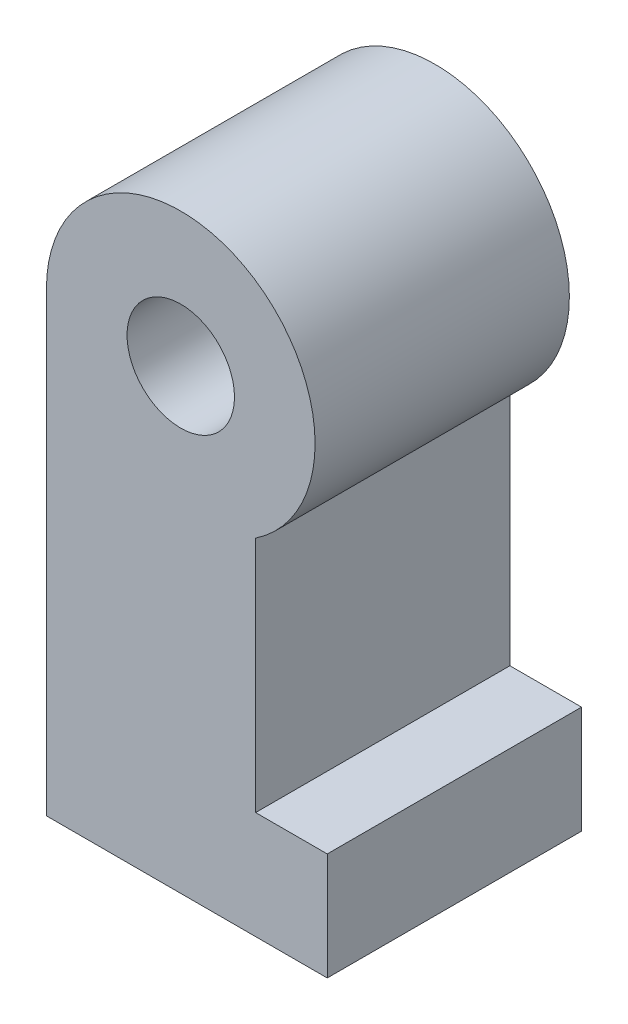
ISO-10303-21;
HEADER;
FILE_DESCRIPTION(('STEP AP214'),'2;1');
FILE_NAME('part.step','',(''),(''),'','','');
FILE_SCHEMA(('AUTOMOTIVE_DESIGN { 1 0 10303 214 1 1 1 1 }'));
ENDSEC;
DATA;
#1=APPLICATION_CONTEXT('core data for automotive mechanical design processes');
#2=APPLICATION_PROTOCOL_DEFINITION('international standard','automotive_design',2000,#1);
#3=PRODUCT_CONTEXT('',#1,'mechanical');
#4=PRODUCT('Part','Part','',(#3));
#5=PRODUCT_RELATED_PRODUCT_CATEGORY('part','',(#4));
#6=PRODUCT_DEFINITION_FORMATION('','',#4);
#7=PRODUCT_DEFINITION_CONTEXT('part definition',#1,'design');
#8=PRODUCT_DEFINITION('design','',#6,#7);
#9=PRODUCT_DEFINITION_SHAPE('','',#8);
#10=(LENGTH_UNIT() NAMED_UNIT(*) SI_UNIT(.MILLI.,.METRE.));
#11=(NAMED_UNIT(*) PLANE_ANGLE_UNIT() SI_UNIT($,.RADIAN.));
#12=(NAMED_UNIT(*) SI_UNIT($,.STERADIAN.) SOLID_ANGLE_UNIT());
#13=UNCERTAINTY_MEASURE_WITH_UNIT(LENGTH_MEASURE(1.E-05),#10,'distance_accuracy_value','');
#14=(GEOMETRIC_REPRESENTATION_CONTEXT(3) GLOBAL_UNCERTAINTY_ASSIGNED_CONTEXT((#13)) GLOBAL_UNIT_ASSIGNED_CONTEXT((#10,
#11,#12)) REPRESENTATION_CONTEXT('',''));
#15=CARTESIAN_POINT('',(0.,0.,0.));
#16=DIRECTION('',(0.,0.,1.));
#17=DIRECTION('',(1.,0.,0.));
#18=AXIS2_PLACEMENT_3D('',#15,#16,#17);
#19=CARTESIAN_POINT('',(0.,0.,180.34));
#20=DIRECTION('',(0.,0.,-1.));
#21=DIRECTION('',(-1.,0.,0.));
#22=AXIS2_PLACEMENT_3D('',#19,#20,#21);
#23=CYLINDRICAL_SURFACE('',#22,95.25);
#24=DIRECTION('',(0.,0.,-1.));
#25=VECTOR('',#24,1.);
#26=CARTESIAN_POINT('',(-95.25,0.,180.34));
#27=LINE('',#26,#25);
#28=CARTESIAN_POINT('',(-95.25,0.,29.2481119136965));
#29=VERTEX_POINT('',#28);
#30=CARTESIAN_POINT('',(-95.25,0.,0.));
#31=VERTEX_POINT('',#30);
#32=EDGE_CURVE('E145',#29,#31,#27,.T.);
#33=ORIENTED_EDGE('',*,*,#32,.F.);
#34=CARTESIAN_POINT('',(-95.25,0.,29.2481119136965));
#35=CARTESIAN_POINT('',(-95.2500220134724,0.794121248174932,29.3772159922998));
#36=CARTESIAN_POINT('',(-95.2400696552208,1.58569458789559,29.5218851932676));
#37=CARTESIAN_POINT('',(-95.2007576113502,3.16207438019551,29.841923412198));
#38=CARTESIAN_POINT('',(-95.1713991743181,3.94688126483763,30.0172904545284));
#39=CARTESIAN_POINT('',(-95.0938432863656,5.50761564638114,30.3981778823305));
#40=CARTESIAN_POINT('',(-95.0456589785493,6.28354895014492,30.6036771688688));
#41=CARTESIAN_POINT('',(-94.9311356611116,7.82557924546193,31.044376187994));
#42=CARTESIAN_POINT('',(-94.8647964323256,8.59167611815374,31.2795762791079));
#43=CARTESIAN_POINT('',(-94.7151917231344,10.1080060481254,31.7775541407689));
#44=CARTESIAN_POINT('',(-94.6320310882169,10.8583070454424,32.0401564343052));
#45=CARTESIAN_POINT('',(-94.4493982110557,12.3465005214786,32.5934245440462));
#46=CARTESIAN_POINT('',(-94.3499242554435,13.0843916878232,32.8840933067182));
#47=CARTESIAN_POINT('',(-94.0283897528177,15.2776373352656,33.7971650888949));
#48=CARTESIAN_POINT('',(-93.7831947188166,16.712780982279,34.4607050306901));
#49=CARTESIAN_POINT('',(-93.2401126255185,19.5161096412237,35.889114846331));
#50=CARTESIAN_POINT('',(-92.9423632278594,20.8844579463577,36.6537187088975));
#51=CARTESIAN_POINT('',(-92.302574694834,23.5515969419685,38.2794096978334));
#52=CARTESIAN_POINT('',(-91.9605367783938,24.8503895453948,39.1404941687376));
#53=CARTESIAN_POINT('',(-91.2409475157097,27.3747591589588,40.9544543379661));
#54=CARTESIAN_POINT('',(-90.8633439664957,28.6002240886648,41.9074650159224));
#55=CARTESIAN_POINT('',(-90.0827243078574,30.9713326820064,43.8985619877328));
#56=CARTESIAN_POINT('',(-89.6797067179223,32.1169716871342,44.9366532390666));
#57=CARTESIAN_POINT('',(-88.8217034992033,34.422546407602,47.1885224007182));
#58=CARTESIAN_POINT('',(-88.3652815767302,35.5747130087689,48.4097152594948));
#59=CARTESIAN_POINT('',(-87.4473067959664,37.7750229807266,50.9407046485899));
#60=CARTESIAN_POINT('',(-86.9857536791977,38.8231610845583,52.250505659496));
#61=CARTESIAN_POINT('',(-86.0708675735019,40.8113530480423,54.9539218497321));
#62=CARTESIAN_POINT('',(-85.6175400955045,41.7513365471575,56.3475907019846));
#63=CARTESIAN_POINT('',(-84.7335727897968,43.5173466770029,59.2122337101381));
#64=CARTESIAN_POINT('',(-84.302933819306,44.3433690039456,60.6832107827185));
#65=CARTESIAN_POINT('',(-83.4508316480257,45.9280424836334,63.799143490031));
#66=CARTESIAN_POINT('',(-83.0319808387057,46.6783003918842,65.4491289580971));
#67=CARTESIAN_POINT('',(-82.4491022802469,47.6954992146937,67.9776804866116));
#68=CARTESIAN_POINT('',(-82.2623423961026,48.0165883508518,68.8296383087411));
#69=CARTESIAN_POINT('',(-81.9061168797037,48.6217424449476,70.5501176288699));
#70=CARTESIAN_POINT('',(-81.7366489012317,48.9058124272082,71.4186368607371));
#71=CARTESIAN_POINT('',(-81.4173428093193,49.4355572452121,73.1694069319148));
#72=CARTESIAN_POINT('',(-81.2674758895146,49.6812885296787,74.0516354391522));
#73=CARTESIAN_POINT('',(-80.9890504666964,50.1338889475921,75.8292190564795));
#74=CARTESIAN_POINT('',(-80.8604890767155,50.3407633467786,76.7245723701907));
#75=CARTESIAN_POINT('',(-80.6264352562528,50.7147821194324,78.526434246614));
#76=CARTESIAN_POINT('',(-80.5209403863469,50.8819306943089,79.4329416189961));
#77=CARTESIAN_POINT('',(-80.3345265663398,51.175742958584,81.2549903029368));
#78=CARTESIAN_POINT('',(-80.2536066431103,51.302408251066,82.1705312552974));
#79=CARTESIAN_POINT('',(-80.1260654960132,51.501341849431,83.8931823198493));
#80=CARTESIAN_POINT('',(-80.0764183383896,51.5784354324405,84.69951545793));
#81=CARTESIAN_POINT('',(-79.9974301844728,51.7008607459022,86.3155748300105));
#82=CARTESIAN_POINT('',(-79.9680887008926,51.746193238544,87.1253009821169));
#83=CARTESIAN_POINT('',(-79.9300643109412,51.804908465703,88.7463353453147));
#84=CARTESIAN_POINT('',(-79.9213798856468,51.8182935493286,89.5576434356946));
#85=CARTESIAN_POINT('',(-79.9247692642722,51.8130656135579,91.1801185316249));
#86=CARTESIAN_POINT('',(-79.9368432001771,51.7944523907111,91.9912855362454));
#87=CARTESIAN_POINT('',(-79.9816027678308,51.725307265008,93.6116220468737));
#88=CARTESIAN_POINT('',(-80.0142867767079,51.6747778752837,94.4207917051201));
#89=CARTESIAN_POINT('',(-80.0998788094375,51.5420036026198,96.035534904769));
#90=CARTESIAN_POINT('',(-80.152789117391,51.4597551377222,96.8411080296267));
#91=CARTESIAN_POINT('',(-80.2782092880363,51.2638777353018,98.4467952492863));
#92=CARTESIAN_POINT('',(-80.3507166357874,51.1502528243621,99.2469100310731));
#93=CARTESIAN_POINT('',(-80.5144991809704,50.8920537950337,100.840218731335));
#94=CARTESIAN_POINT('',(-80.6057761937458,50.7474766829889,101.633411972639));
#95=CARTESIAN_POINT('',(-80.8874736396491,50.2980802512927,103.852130120598));
#96=CARTESIAN_POINT('',(-81.0982228318792,49.9584592965961,105.268218032507));
#97=CARTESIAN_POINT('',(-81.570906030824,49.1828767604152,108.064583860333));
#98=CARTESIAN_POINT('',(-81.8328357184361,48.7469233079877,109.444864786862));
#99=CARTESIAN_POINT('',(-82.3997264285212,47.782427309182,112.163903944588));
#100=CARTESIAN_POINT('',(-82.704697042851,47.2538641179653,113.502652838849));
#101=CARTESIAN_POINT('',(-83.3488899042599,46.1080995608993,116.133138881134));
#102=CARTESIAN_POINT('',(-83.6881150419726,45.4908907126573,117.424872049111));
#103=CARTESIAN_POINT('',(-84.4338042253054,44.093025956981,120.107639405374));
#104=CARTESIAN_POINT('',(-84.8434667733187,43.3016611775492,121.49221114328));
#105=CARTESIAN_POINT('',(-85.6822534320534,41.617292822323,124.191865943504));
#106=CARTESIAN_POINT('',(-86.1113786771919,40.7242833173976,125.50694494562));
#107=CARTESIAN_POINT('',(-86.9775478136138,38.8399896135011,128.064042460947));
#108=CARTESIAN_POINT('',(-87.4145989547771,37.848611302122,129.305989160864));
#109=CARTESIAN_POINT('',(-88.2846203285219,35.772271219455,131.71063446528));
#110=CARTESIAN_POINT('',(-88.7175903651711,34.6873049801738,132.873329281454));
#111=CARTESIAN_POINT('',(-89.6215306934933,32.2860537192009,135.254838926975));
#112=CARTESIAN_POINT('',(-90.0904597812939,30.9578213844823,136.462414607273));
#113=CARTESIAN_POINT('',(-90.9933967140653,28.1935684253827,138.762801340117));
#114=CARTESIAN_POINT('',(-91.4273996821299,26.757532801822,139.855596371755));
#115=CARTESIAN_POINT('',(-92.0403123360418,24.5303057793655,141.400472075021));
#116=CARTESIAN_POINT('',(-92.2381233889816,23.7763400230092,141.89934595837));
#117=CARTESIAN_POINT('',(-92.6194413138155,22.244641846475,142.864978958007));
#118=CARTESIAN_POINT('',(-92.8029498673844,21.4669122354437,143.331741849116));
#119=CARTESIAN_POINT('',(-93.1538659917669,19.8890140093204,144.231883975318));
#120=CARTESIAN_POINT('',(-93.3212764445548,19.0888494439154,144.665269183099));
#121=CARTESIAN_POINT('',(-93.6383178594851,17.467409905948,145.497499284357));
#122=CARTESIAN_POINT('',(-93.7879500274312,16.6461363696922,145.896346519856));
#123=CARTESIAN_POINT('',(-94.1374245806488,14.5705055737626,146.847858070446));
#124=CARTESIAN_POINT('',(-94.3252358516976,13.3038653140324,147.378388800996));
#125=CARTESIAN_POINT('',(-94.6522570498188,10.7327146660136,148.355385598381));
#126=CARTESIAN_POINT('',(-94.7914802626076,9.4282147357552,148.801874629822));
#127=CARTESIAN_POINT('',(-94.9608505118198,7.4459393164585,149.406775883158));
#128=CARTESIAN_POINT('',(-95.0107868741102,6.77963752541998,149.597905020841));
#129=CARTESIAN_POINT('',(-95.0968871156354,5.44011248072531,149.957815953981));
#130=CARTESIAN_POINT('',(-95.1330511510972,4.76688930567107,150.12659800292));
#131=CARTESIAN_POINT('',(-95.1912001365327,3.41414803637313,150.441564240727));
#132=CARTESIAN_POINT('',(-95.2131765586943,2.73462640470596,150.58773479835));
#133=CARTESIAN_POINT('',(-95.242582771914,1.37070401489649,150.85710590437));
#134=CARTESIAN_POINT('',(-95.2500119398157,0.686303048999961,150.980305468561));
#135=CARTESIAN_POINT('',(-95.25,0.,151.091888086302));
#136=B_SPLINE_CURVE_WITH_KNOTS('',3,(#34,#35,#36,#37,#38,#39,#40,#41,#42,#43,#44,#45,#46,#47,
#48,#49,#50,#51,#52,#53,#54,#55,#56,#57,#58,#59,#60,#61,#62,#63,#64,#65,#66,#67,#68,#69,#70,#71,
#72,#73,#74,#75,#76,#77,#78,#79,#80,#81,#82,#83,#84,#85,#86,#87,#88,#89,#90,#91,#92,#93,#94,#95,
#96,#97,#98,#99,#100,#101,#102,#103,#104,#105,#106,#107,#108,#109,#110,#111,#112,#113,#114,#115,
#116,#117,#118,#119,#120,#121,#122,#123,#124,#125,#126,#127,#128,#129,#130,#131,#132,#133,#134,
#135),.UNSPECIFIED.,.F.,.F.,(4,2,2,2,2,2,2,2,2,2,2,2,2,2,2,2,2,2,2,2,2,2,2,2,2,2,2,2,2,2,2,2,2,
2,2,2,2,2,2,2,2,2,2,2,2,2,2,2,2,2,4),(0.,2.41340083995905,4.82664641685825,7.23821021099756,
9.6498031186094,12.0468040549886,14.4440569068997,19.2378763681504,24.0193203037042,
28.8006326704239,33.5890757515286,38.3777980445434,43.5918802267156,48.806226263165,
54.0239455656037,59.2418618633126,64.8143780075282,67.6017682142925,70.3887797153127,
73.171648172161,75.9541392325705,78.7363358852274,81.5184223530045,83.9521599534604,
86.3858391480795,88.819339387579,91.2528550997285,93.6861792166911,96.119778203533,
98.5530650282433,100.986587303657,105.395770046019,109.804580859701,114.214375751989,
118.624543084757,123.55924557632,128.494236066167,133.433994389142,138.37398867241,
143.933312140623,149.493410542445,152.268976791837,155.044216198802,157.818957837879,
160.593511173871,164.747724091098,168.900800206016,170.985266143249,173.069708434574,
175.15540246729,177.241185842293),.UNSPECIFIED.);
#137=CARTESIAN_POINT('',(-95.25,0.,151.091888086302));
#138=VERTEX_POINT('',#137);
#139=EDGE_CURVE('E47',#29,#138,#136,.T.);
#140=ORIENTED_EDGE('',*,*,#139,.T.);
#141=CARTESIAN_POINT('',(-95.25,0.,180.34));
#142=VERTEX_POINT('',#141);
#143=EDGE_CURVE('E41',#142,#138,#27,.T.);
#144=ORIENTED_EDGE('',*,*,#143,.F.);
#145=CARTESIAN_POINT('',(0.,0.,180.34));
#146=DIRECTION('',(0.,0.,1.));
#147=DIRECTION('',(1.,0.,0.));
#148=AXIS2_PLACEMENT_3D('',#145,#146,#147);
#149=CIRCLE('',#148,95.25);
#150=CARTESIAN_POINT('',(53.086,-79.0850118796223,180.34));
#151=VERTEX_POINT('',#150);
#152=EDGE_CURVE('E139',#151,#142,#149,.T.);
#153=ORIENTED_EDGE('',*,*,#152,.F.);
#154=DIRECTION('',(0.,0.,-1.));
#155=VECTOR('',#154,1.);
#156=CARTESIAN_POINT('',(53.086,-79.0850118796223,180.34));
#157=LINE('',#156,#155);
#158=CARTESIAN_POINT('',(53.086,-79.0850118796223,0.));
#159=VERTEX_POINT('',#158);
#160=EDGE_CURVE('E123',#151,#159,#157,.T.);
#161=ORIENTED_EDGE('',*,*,#160,.T.);
#162=CARTESIAN_POINT('',(0.,0.,0.));
#163=DIRECTION('',(0.,0.,1.));
#164=DIRECTION('',(1.,0.,0.));
#165=AXIS2_PLACEMENT_3D('',#162,#163,#164);
#166=CIRCLE('',#165,95.25);
#167=EDGE_CURVE('E127',#159,#31,#166,.T.);
#168=ORIENTED_EDGE('',*,*,#167,.T.);
#169=EDGE_LOOP('',(#33,#140,#144,#153,#161,#168));
#170=FACE_BOUND('',#169,.T.);
#171=ADVANCED_FACE('F33',(#170),#23,.T.);
#172=CARTESIAN_POINT('',(-95.25,0.,180.34));
#173=DIRECTION('',(1.,0.,0.));
#174=DIRECTION('',(0.,1.,0.));
#175=AXIS2_PLACEMENT_3D('',#172,#173,#174);
#176=PLANE('',#175);
#177=CARTESIAN_POINT('',(-95.25,-209.55,90.17));
#178=DIRECTION('',(-1.,0.,0.));
#179=DIRECTION('',(0.,-1.,0.));
#180=AXIS2_PLACEMENT_3D('',#177,#178,#179);
#181=CIRCLE('',#180,61.7220000000001);
#182=CARTESIAN_POINT('',(-95.25,-271.272,90.17));
#183=VERTEX_POINT('',#182);
#184=EDGE_CURVE('E333',#183,#183,#181,.T.);
#185=ORIENTED_EDGE('',*,*,#184,.F.);
#186=EDGE_LOOP('',(#185));
#187=FACE_BOUND('',#186,.T.);
#188=ORIENTED_EDGE('',*,*,#143,.T.);
#189=CARTESIAN_POINT('',(-95.25,-9.90599999999995,90.1699999999993));
#190=DIRECTION('',(1.,0.,0.));
#191=DIRECTION('',(0.,1.,0.));
#192=AXIS2_PLACEMENT_3D('',#189,#190,#191);
#193=CIRCLE('',#192,61.7220000000001);
#194=EDGE_CURVE('E11',#138,#29,#193,.T.);
#195=ORIENTED_EDGE('',*,*,#194,.T.);
#196=ORIENTED_EDGE('',*,*,#32,.T.);
#197=DIRECTION('',(0.,-1.,0.));
#198=VECTOR('',#197,1.);
#199=CARTESIAN_POINT('',(-95.25,0.,0.));
#200=LINE('',#199,#198);
#201=CARTESIAN_POINT('',(-95.25,-323.85,0.));
#202=VERTEX_POINT('',#201);
#203=EDGE_CURVE('E130',#31,#202,#200,.T.);
#204=ORIENTED_EDGE('',*,*,#203,.T.);
#205=DIRECTION('',(0.,0.,-1.));
#206=VECTOR('',#205,1.);
#207=CARTESIAN_POINT('',(-95.25,-323.85,180.34));
#208=LINE('',#207,#206);
#209=CARTESIAN_POINT('',(-95.25,-323.85,180.34));
#210=VERTEX_POINT('',#209);
#211=EDGE_CURVE('E143',#210,#202,#208,.T.);
#212=ORIENTED_EDGE('',*,*,#211,.F.);
#213=DIRECTION('',(0.,-1.,0.));
#214=VECTOR('',#213,1.);
#215=CARTESIAN_POINT('',(-95.25,0.,180.34));
#216=LINE('',#215,#214);
#217=EDGE_CURVE('E91',#142,#210,#216,.T.);
#218=ORIENTED_EDGE('',*,*,#217,.F.);
#219=EDGE_LOOP('',(#188,#195,#196,#204,#212,#218));
#220=FACE_BOUND('',#219,.T.);
#221=ADVANCED_FACE('F149',(#187,#220),#176,.F.);
#222=CARTESIAN_POINT('',(-95.25,-323.85,180.34));
#223=DIRECTION('',(0.,1.,0.));
#224=DIRECTION('',(0.,0.,1.));
#225=AXIS2_PLACEMENT_3D('',#222,#223,#224);
#226=PLANE('',#225);
#227=CARTESIAN_POINT('',(0.,-323.85,90.17));
#228=DIRECTION('',(0.,-1.,0.));
#229=DIRECTION('',(0.,0.,-1.));
#230=AXIS2_PLACEMENT_3D('',#227,#228,#229);
#231=CIRCLE('',#230,61.722);
#232=CARTESIAN_POINT('',(0.,-323.85,28.448));
#233=VERTEX_POINT('',#232);
#234=EDGE_CURVE('E310',#233,#233,#231,.T.);
#235=ORIENTED_EDGE('',*,*,#234,.F.);
#236=EDGE_LOOP('',(#235));
#237=FACE_BOUND('',#236,.T.);
#238=DIRECTION('',(1.,0.,0.));
#239=VECTOR('',#238,1.);
#240=CARTESIAN_POINT('',(-95.25,-323.85,0.));
#241=LINE('',#240,#239);
#242=CARTESIAN_POINT('',(103.886,-323.85,0.));
#243=VERTEX_POINT('',#242);
#244=EDGE_CURVE('E133',#202,#243,#241,.T.);
#245=ORIENTED_EDGE('',*,*,#244,.T.);
#246=DIRECTION('',(0.,0.,-1.));
#247=VECTOR('',#246,1.);
#248=CARTESIAN_POINT('',(103.886,-323.85,180.34));
#249=LINE('',#248,#247);
#250=CARTESIAN_POINT('',(103.886,-323.85,180.34));
#251=VERTEX_POINT('',#250);
#252=EDGE_CURVE('E118',#251,#243,#249,.T.);
#253=ORIENTED_EDGE('',*,*,#252,.F.);
#254=DIRECTION('',(1.,0.,0.));
#255=VECTOR('',#254,1.);
#256=CARTESIAN_POINT('',(-95.25,-323.85,180.34));
#257=LINE('',#256,#255);
#258=EDGE_CURVE('E106',#210,#251,#257,.T.);
#259=ORIENTED_EDGE('',*,*,#258,.F.);
#260=ORIENTED_EDGE('',*,*,#211,.T.);
#261=EDGE_LOOP('',(#245,#253,#259,#260));
#262=FACE_BOUND('',#261,.T.);
#263=ADVANCED_FACE('F171',(#237,#262),#226,.F.);
#264=CARTESIAN_POINT('',(103.886,-323.85,180.34));
#265=DIRECTION('',(-1.,0.,0.));
#266=DIRECTION('',(0.,0.,1.));
#267=AXIS2_PLACEMENT_3D('',#264,#265,#266);
#268=PLANE('',#267);
#269=DIRECTION('',(0.,1.,0.));
#270=VECTOR('',#269,1.);
#271=CARTESIAN_POINT('',(103.886,-323.85,0.));
#272=LINE('',#271,#270);
#273=CARTESIAN_POINT('',(103.886,-247.65,0.));
#274=VERTEX_POINT('',#273);
#275=EDGE_CURVE('E115',#243,#274,#272,.T.);
#276=ORIENTED_EDGE('',*,*,#275,.T.);
#277=DIRECTION('',(0.,0.,-1.));
#278=VECTOR('',#277,1.);
#279=CARTESIAN_POINT('',(103.886,-247.65,180.34));
#280=LINE('',#279,#278);
#281=CARTESIAN_POINT('',(103.886,-247.65,180.34));
#282=VERTEX_POINT('',#281);
#283=EDGE_CURVE('E112',#282,#274,#280,.T.);
#284=ORIENTED_EDGE('',*,*,#283,.F.);
#285=DIRECTION('',(0.,1.,0.));
#286=VECTOR('',#285,1.);
#287=CARTESIAN_POINT('',(103.886,-323.85,180.34));
#288=LINE('',#287,#286);
#289=EDGE_CURVE('E99',#251,#282,#288,.T.);
#290=ORIENTED_EDGE('',*,*,#289,.F.);
#291=ORIENTED_EDGE('',*,*,#252,.T.);
#292=EDGE_LOOP('',(#276,#284,#290,#291));
#293=FACE_BOUND('',#292,.T.);
#294=ADVANCED_FACE('F113',(#293),#268,.F.);
#295=CARTESIAN_POINT('',(103.886,-247.65,180.34));
#296=DIRECTION('',(0.,-1.,0.));
#297=DIRECTION('',(1.,0.,0.));
#298=AXIS2_PLACEMENT_3D('',#295,#296,#297);
#299=PLANE('',#298);
#300=DIRECTION('',(-1.,0.,0.));
#301=VECTOR('',#300,1.);
#302=CARTESIAN_POINT('',(103.886,-247.65,0.));
#303=LINE('',#302,#301);
#304=CARTESIAN_POINT('',(53.086,-247.65,0.));
#305=VERTEX_POINT('',#304);
#306=EDGE_CURVE('E136',#274,#305,#303,.T.);
#307=ORIENTED_EDGE('',*,*,#306,.T.);
#308=DIRECTION('',(0.,0.,-1.));
#309=VECTOR('',#308,1.);
#310=CARTESIAN_POINT('',(53.086,-247.65,180.34));
#311=LINE('',#310,#309);
#312=CARTESIAN_POINT('',(53.086,-247.65,180.34));
#313=VERTEX_POINT('',#312);
#314=EDGE_CURVE('E119',#313,#305,#311,.T.);
#315=ORIENTED_EDGE('',*,*,#314,.F.);
#316=DIRECTION('',(-1.,0.,0.));
#317=VECTOR('',#316,1.);
#318=CARTESIAN_POINT('',(103.886,-247.65,180.34));
#319=LINE('',#318,#317);
#320=EDGE_CURVE('E103',#282,#313,#319,.T.);
#321=ORIENTED_EDGE('',*,*,#320,.F.);
#322=ORIENTED_EDGE('',*,*,#283,.T.);
#323=EDGE_LOOP('',(#307,#315,#321,#322));
#324=FACE_BOUND('',#323,.T.);
#325=ADVANCED_FACE('F121',(#324),#299,.F.);
#326=CARTESIAN_POINT('',(53.086,-247.65,180.34));
#327=DIRECTION('',(-1.,0.,0.));
#328=DIRECTION('',(0.,0.,1.));
#329=AXIS2_PLACEMENT_3D('',#326,#327,#328);
#330=PLANE('',#329);
#331=DIRECTION('',(0.,1.,0.));
#332=VECTOR('',#331,1.);
#333=CARTESIAN_POINT('',(53.086,-247.65,0.));
#334=LINE('',#333,#332);
#335=EDGE_CURVE('E82',#305,#159,#334,.T.);
#336=ORIENTED_EDGE('',*,*,#335,.T.);
#337=ORIENTED_EDGE('',*,*,#160,.F.);
#338=DIRECTION('',(0.,1.,0.));
#339=VECTOR('',#338,1.);
#340=CARTESIAN_POINT('',(53.086,-247.65,180.34));
#341=LINE('',#340,#339);
#342=EDGE_CURVE('E55',#313,#151,#341,.T.);
#343=ORIENTED_EDGE('',*,*,#342,.F.);
#344=ORIENTED_EDGE('',*,*,#314,.T.);
#345=EDGE_LOOP('',(#336,#337,#343,#344));
#346=FACE_BOUND('',#345,.T.);
#347=ADVANCED_FACE('F156',(#346),#330,.F.);
#348=CARTESIAN_POINT('',(0.,0.,180.34));
#349=DIRECTION('',(0.,0.,1.));
#350=DIRECTION('',(1.,0.,0.));
#351=AXIS2_PLACEMENT_3D('',#348,#349,#350);
#352=PLANE('',#351);
#353=CARTESIAN_POINT('',(0.,0.,180.34));
#354=DIRECTION('',(0.,0.,1.));
#355=DIRECTION('',(1.,0.,0.));
#356=AXIS2_PLACEMENT_3D('',#353,#354,#355);
#357=CIRCLE('',#356,38.1);
#358=CARTESIAN_POINT('',(38.1,0.,180.34));
#359=VERTEX_POINT('',#358);
#360=EDGE_CURVE('E317',#359,#359,#357,.T.);
#361=ORIENTED_EDGE('',*,*,#360,.F.);
#362=EDGE_LOOP('',(#361));
#363=FACE_BOUND('',#362,.T.);
#364=ORIENTED_EDGE('',*,*,#152,.T.);
#365=ORIENTED_EDGE('',*,*,#217,.T.);
#366=ORIENTED_EDGE('',*,*,#258,.T.);
#367=ORIENTED_EDGE('',*,*,#289,.T.);
#368=ORIENTED_EDGE('',*,*,#320,.T.);
#369=ORIENTED_EDGE('',*,*,#342,.T.);
#370=EDGE_LOOP('',(#364,#365,#366,#367,#368,#369));
#371=FACE_BOUND('',#370,.T.);
#372=ADVANCED_FACE('F101',(#363,#371),#352,.T.);
#373=CARTESIAN_POINT('',(0.,0.,0.));
#374=DIRECTION('',(0.,0.,1.));
#375=DIRECTION('',(1.,0.,0.));
#376=AXIS2_PLACEMENT_3D('',#373,#374,#375);
#377=PLANE('',#376);
#378=ORIENTED_EDGE('',*,*,#167,.F.);
#379=ORIENTED_EDGE('',*,*,#335,.F.);
#380=ORIENTED_EDGE('',*,*,#306,.F.);
#381=ORIENTED_EDGE('',*,*,#275,.F.);
#382=ORIENTED_EDGE('',*,*,#244,.F.);
#383=ORIENTED_EDGE('',*,*,#203,.F.);
#384=EDGE_LOOP('',(#378,#379,#380,#381,#382,#383));
#385=FACE_BOUND('',#384,.T.);
#386=ADVANCED_FACE('F154',(#385),#377,.F.);
#387=CARTESIAN_POINT('',(0.,0.,78.74));
#388=DIRECTION('',(0.,0.,1.));
#389=DIRECTION('',(1.,0.,0.));
#390=AXIS2_PLACEMENT_3D('',#387,#388,#389);
#391=CYLINDRICAL_SURFACE('',#390,38.1);
#392=CARTESIAN_POINT('',(0.,0.,78.74));
#393=DIRECTION('',(0.,0.,1.));
#394=DIRECTION('',(1.,0.,0.));
#395=AXIS2_PLACEMENT_3D('',#392,#393,#394);
#396=CIRCLE('',#395,38.1);
#397=CARTESIAN_POINT('',(38.1,0.,78.74));
#398=VERTEX_POINT('',#397);
#399=EDGE_CURVE('E131',#398,#398,#396,.T.);
#400=ORIENTED_EDGE('',*,*,#399,.F.);
#401=EDGE_LOOP('',(#400));
#402=FACE_BOUND('',#401,.T.);
#403=ORIENTED_EDGE('',*,*,#360,.T.);
#404=EDGE_LOOP('',(#403));
#405=FACE_BOUND('',#404,.T.);
#406=ADVANCED_FACE('F203',(#402,#405),#391,.F.);
#407=CARTESIAN_POINT('',(0.,0.,78.74));
#408=DIRECTION('',(0.,0.,1.));
#409=DIRECTION('',(1.,0.,0.));
#410=AXIS2_PLACEMENT_3D('',#407,#408,#409);
#411=PLANE('',#410);
#412=ORIENTED_EDGE('',*,*,#399,.T.);
#413=EDGE_LOOP('',(#412));
#414=FACE_BOUND('',#413,.T.);
#415=ADVANCED_FACE('F216',(#414),#411,.T.);
#416=CARTESIAN_POINT('',(0.,-273.05,90.17));
#417=DIRECTION('',(0.,-1.,0.));
#418=DIRECTION('',(0.,0.,-1.));
#419=AXIS2_PLACEMENT_3D('',#416,#417,#418);
#420=CYLINDRICAL_SURFACE('',#419,61.722);
#421=CARTESIAN_POINT('',(0.,-273.05,90.17));
#422=DIRECTION('',(0.,-1.,0.));
#423=DIRECTION('',(0.,0.,-1.));
#424=AXIS2_PLACEMENT_3D('',#421,#422,#423);
#425=CIRCLE('',#424,61.722);
#426=CARTESIAN_POINT('',(0.,-273.05,28.448));
#427=VERTEX_POINT('',#426);
#428=EDGE_CURVE('E314',#427,#427,#425,.T.);
#429=ORIENTED_EDGE('',*,*,#428,.F.);
#430=EDGE_LOOP('',(#429));
#431=FACE_BOUND('',#430,.T.);
#432=ORIENTED_EDGE('',*,*,#234,.T.);
#433=EDGE_LOOP('',(#432));
#434=FACE_BOUND('',#433,.T.);
#435=ADVANCED_FACE('F225',(#431,#434),#420,.F.);
#436=CARTESIAN_POINT('',(0.,-273.05,90.17));
#437=DIRECTION('',(0.,-1.,0.));
#438=DIRECTION('',(0.,0.,-1.));
#439=AXIS2_PLACEMENT_3D('',#436,#437,#438);
#440=PLANE('',#439);
#441=ORIENTED_EDGE('',*,*,#428,.T.);
#442=EDGE_LOOP('',(#441));
#443=FACE_BOUND('',#442,.T.);
#444=ADVANCED_FACE('F241',(#443),#440,.T.);
#445=CARTESIAN_POINT('',(-44.45,-9.90599999999995,90.1699999999993));
#446=DIRECTION('',(-1.,0.,0.));
#447=DIRECTION('',(0.,-1.,0.));
#448=AXIS2_PLACEMENT_3D('',#445,#446,#447);
#449=CYLINDRICAL_SURFACE('',#448,61.7220000000001);
#450=CARTESIAN_POINT('',(-44.45,-9.90599999999995,90.1699999999993));
#451=DIRECTION('',(-1.,0.,0.));
#452=DIRECTION('',(0.,-1.,0.));
#453=AXIS2_PLACEMENT_3D('',#450,#451,#452);
#454=CIRCLE('',#453,61.7220000000001);
#455=CARTESIAN_POINT('',(-44.45,-71.628,90.1699999999993));
#456=VERTEX_POINT('',#455);
#457=EDGE_CURVE('E312',#456,#456,#454,.T.);
#458=ORIENTED_EDGE('',*,*,#457,.F.);
#459=EDGE_LOOP('',(#458));
#460=FACE_BOUND('',#459,.T.);
#461=ORIENTED_EDGE('',*,*,#194,.F.);
#462=ORIENTED_EDGE('',*,*,#139,.F.);
#463=EDGE_LOOP('',(#461,#462));
#464=FACE_BOUND('',#463,.T.);
#465=ADVANCED_FACE('F250',(#460,#464),#449,.F.);
#466=CARTESIAN_POINT('',(-44.45,-9.90599999999995,90.1699999999993));
#467=DIRECTION('',(-1.,0.,0.));
#468=DIRECTION('',(0.,-1.,0.));
#469=AXIS2_PLACEMENT_3D('',#466,#467,#468);
#470=PLANE('',#469);
#471=ORIENTED_EDGE('',*,*,#457,.T.);
#472=EDGE_LOOP('',(#471));
#473=FACE_BOUND('',#472,.T.);
#474=ADVANCED_FACE('F268',(#473),#470,.T.);
#475=CARTESIAN_POINT('',(-44.45,-209.55,90.17));
#476=DIRECTION('',(-1.,0.,0.));
#477=DIRECTION('',(0.,-1.,0.));
#478=AXIS2_PLACEMENT_3D('',#475,#476,#477);
#479=CYLINDRICAL_SURFACE('',#478,61.7220000000001);
#480=CARTESIAN_POINT('',(-44.45,-209.55,90.17));
#481=DIRECTION('',(-1.,0.,0.));
#482=DIRECTION('',(0.,-1.,0.));
#483=AXIS2_PLACEMENT_3D('',#480,#481,#482);
#484=CIRCLE('',#483,61.7220000000001);
#485=CARTESIAN_POINT('',(-44.45,-271.272,90.17));
#486=VERTEX_POINT('',#485);
#487=EDGE_CURVE('E311',#486,#486,#484,.T.);
#488=ORIENTED_EDGE('',*,*,#487,.F.);
#489=EDGE_LOOP('',(#488));
#490=FACE_BOUND('',#489,.T.);
#491=ORIENTED_EDGE('',*,*,#184,.T.);
#492=EDGE_LOOP('',(#491));
#493=FACE_BOUND('',#492,.T.);
#494=ADVANCED_FACE('F278',(#490,#493),#479,.F.);
#495=CARTESIAN_POINT('',(-44.45,-209.55,90.17));
#496=DIRECTION('',(-1.,0.,0.));
#497=DIRECTION('',(0.,-1.,0.));
#498=AXIS2_PLACEMENT_3D('',#495,#496,#497);
#499=PLANE('',#498);
#500=ORIENTED_EDGE('',*,*,#487,.T.);
#501=EDGE_LOOP('',(#500));
#502=FACE_BOUND('',#501,.T.);
#503=ADVANCED_FACE('F288',(#502),#499,.T.);
#504=CLOSED_SHELL('',(#171,#221,#263,#294,#325,#347,#372,#386,#406,#415,#435,#444,#465,#474,
#494,#503));
#505=MANIFOLD_SOLID_BREP('B2',#504);
#506=ADVANCED_BREP_SHAPE_REPRESENTATION('',(#18,#505),#14);
#507=SHAPE_DEFINITION_REPRESENTATION(#9,#506);
ENDSEC;
END-ISO-10303-21;
